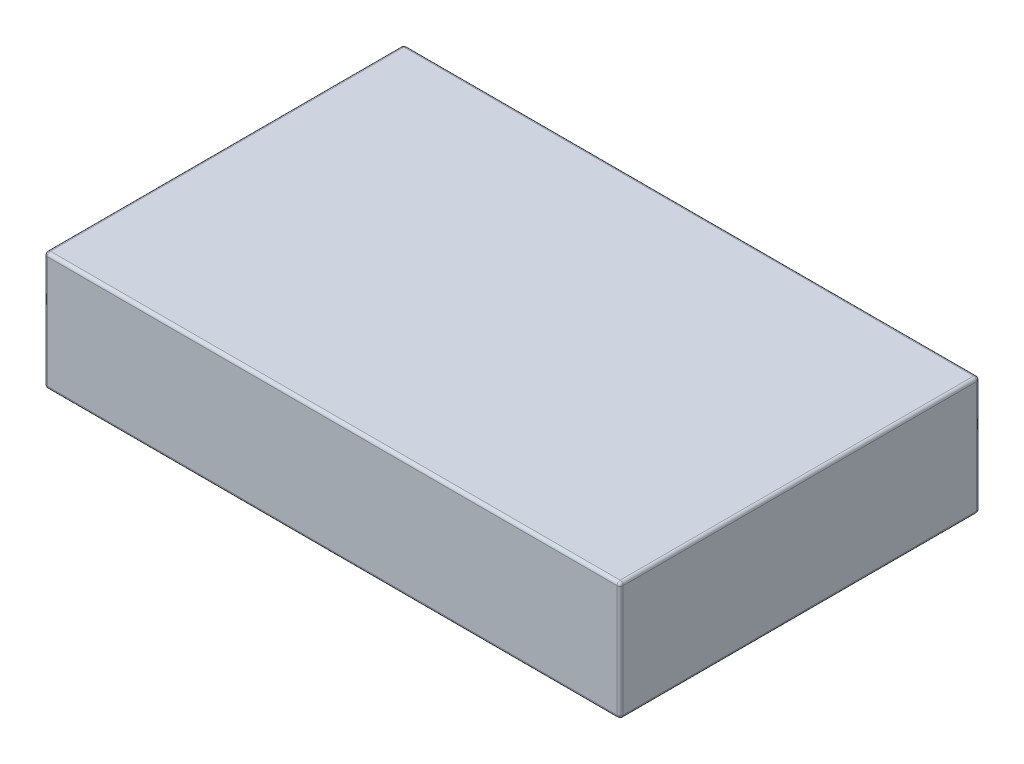
ISO-10303-21;
HEADER;
FILE_DESCRIPTION(('STEP AP214'),'2;1');
FILE_NAME('part.step','',(''),(''),'','','');
FILE_SCHEMA(('AUTOMOTIVE_DESIGN { 1 0 10303 214 1 1 1 1 }'));
ENDSEC;
DATA;
#1=APPLICATION_CONTEXT('core data for automotive mechanical design processes');
#2=APPLICATION_PROTOCOL_DEFINITION('international standard','automotive_design',2000,#1);
#3=PRODUCT_CONTEXT('',#1,'mechanical');
#4=PRODUCT('Part','Part','',(#3));
#5=PRODUCT_RELATED_PRODUCT_CATEGORY('part','',(#4));
#6=PRODUCT_DEFINITION_FORMATION('','',#4);
#7=PRODUCT_DEFINITION_CONTEXT('part definition',#1,'design');
#8=PRODUCT_DEFINITION('design','',#6,#7);
#9=PRODUCT_DEFINITION_SHAPE('','',#8);
#10=(LENGTH_UNIT() NAMED_UNIT(*) SI_UNIT(.MILLI.,.METRE.));
#11=(NAMED_UNIT(*) PLANE_ANGLE_UNIT() SI_UNIT($,.RADIAN.));
#12=(NAMED_UNIT(*) SI_UNIT($,.STERADIAN.) SOLID_ANGLE_UNIT());
#13=UNCERTAINTY_MEASURE_WITH_UNIT(LENGTH_MEASURE(1.E-05),#10,'distance_accuracy_value','');
#14=(GEOMETRIC_REPRESENTATION_CONTEXT(3) GLOBAL_UNCERTAINTY_ASSIGNED_CONTEXT((#13)) GLOBAL_UNIT_ASSIGNED_CONTEXT((#10,
#11,#12)) REPRESENTATION_CONTEXT('',''));
#15=CARTESIAN_POINT('',(0.,0.,0.));
#16=DIRECTION('',(0.,0.,1.));
#17=DIRECTION('',(1.,0.,0.));
#18=AXIS2_PLACEMENT_3D('',#15,#16,#17);
#19=CARTESIAN_POINT('',(-182.5,75.,-114.));
#20=DIRECTION('',(1.,0.,0.));
#21=DIRECTION('',(0.,0.,-1.));
#22=AXIS2_PLACEMENT_3D('',#19,#20,#21);
#23=PLANE('',#22);
#24=DIRECTION('',(0.,-1.,0.));
#25=VECTOR('',#24,1.);
#26=CARTESIAN_POINT('',(-182.5,75.,-112.));
#27=LINE('',#26,#25);
#28=CARTESIAN_POINT('',(-182.5,73.,-112.));
#29=VERTEX_POINT('',#28);
#30=CARTESIAN_POINT('',(-182.5,2.,-112.));
#31=VERTEX_POINT('',#30);
#32=EDGE_CURVE('E48',#29,#31,#27,.T.);
#33=ORIENTED_EDGE('',*,*,#32,.T.);
#34=DIRECTION('',(0.,0.,1.));
#35=VECTOR('',#34,1.);
#36=CARTESIAN_POINT('',(-182.5,2.,-114.));
#37=LINE('',#36,#35);
#38=CARTESIAN_POINT('',(-182.5,2.,112.));
#39=VERTEX_POINT('',#38);
#40=EDGE_CURVE('E11',#31,#39,#37,.T.);
#41=ORIENTED_EDGE('',*,*,#40,.T.);
#42=DIRECTION('',(0.,-1.,0.));
#43=VECTOR('',#42,1.);
#44=CARTESIAN_POINT('',(-182.5,75.,112.));
#45=LINE('',#44,#43);
#46=CARTESIAN_POINT('',(-182.5,73.,112.));
#47=VERTEX_POINT('',#46);
#48=EDGE_CURVE('E304',#39,#47,#45,.F.);
#49=ORIENTED_EDGE('',*,*,#48,.T.);
#50=DIRECTION('',(0.,0.,1.));
#51=VECTOR('',#50,1.);
#52=CARTESIAN_POINT('',(-182.5,73.,-114.));
#53=LINE('',#52,#51);
#54=EDGE_CURVE('E301',#47,#29,#53,.F.);
#55=ORIENTED_EDGE('',*,*,#54,.T.);
#56=EDGE_LOOP('',(#33,#41,#49,#55));
#57=FACE_BOUND('',#56,.T.);
#58=CARTESIAN_POINT('',(-182.5,37.5000000000001,86.));
#59=DIRECTION('',(1.,0.,0.));
#60=DIRECTION('',(0.,0.,-1.));
#61=AXIS2_PLACEMENT_3D('',#58,#59,#60);
#62=CIRCLE('',#61,7.50000000000001);
#63=CARTESIAN_POINT('',(-182.5,37.5000000000001,78.5));
#64=VERTEX_POINT('',#63);
#65=EDGE_CURVE('E152',#64,#64,#62,.F.);
#66=ORIENTED_EDGE('',*,*,#65,.F.);
#67=EDGE_LOOP('',(#66));
#68=FACE_BOUND('',#67,.T.);
#69=CARTESIAN_POINT('',(-182.5,37.5,-86.));
#70=DIRECTION('',(1.,0.,0.));
#71=DIRECTION('',(0.,0.,-1.));
#72=AXIS2_PLACEMENT_3D('',#69,#70,#71);
#73=CIRCLE('',#72,7.50000000000001);
#74=CARTESIAN_POINT('',(-182.5,37.5,-93.5));
#75=VERTEX_POINT('',#74);
#76=EDGE_CURVE('E237',#75,#75,#73,.F.);
#77=ORIENTED_EDGE('',*,*,#76,.F.);
#78=EDGE_LOOP('',(#77));
#79=FACE_BOUND('',#78,.T.);
#80=ADVANCED_FACE('F38',(#57,#68,#79),#23,.F.);
#81=CARTESIAN_POINT('',(-182.5,75.,114.));
#82=DIRECTION('',(0.,0.,-1.));
#83=DIRECTION('',(-1.,0.,0.));
#84=AXIS2_PLACEMENT_3D('',#81,#82,#83);
#85=PLANE('',#84);
#86=DIRECTION('',(1.,0.,0.));
#87=VECTOR('',#86,1.);
#88=CARTESIAN_POINT('',(-182.5,2.,114.));
#89=LINE('',#88,#87);
#90=CARTESIAN_POINT('',(-180.5,2.,114.));
#91=VERTEX_POINT('',#90);
#92=CARTESIAN_POINT('',(180.5,2.,114.));
#93=VERTEX_POINT('',#92);
#94=EDGE_CURVE('E269',#91,#93,#89,.T.);
#95=ORIENTED_EDGE('',*,*,#94,.T.);
#96=DIRECTION('',(0.,-1.,0.));
#97=VECTOR('',#96,1.);
#98=CARTESIAN_POINT('',(180.5,75.,114.));
#99=LINE('',#98,#97);
#100=CARTESIAN_POINT('',(180.5,73.,114.));
#101=VERTEX_POINT('',#100);
#102=EDGE_CURVE('E272',#93,#101,#99,.F.);
#103=ORIENTED_EDGE('',*,*,#102,.T.);
#104=DIRECTION('',(1.,0.,0.));
#105=VECTOR('',#104,1.);
#106=CARTESIAN_POINT('',(-182.5,73.,114.));
#107=LINE('',#106,#105);
#108=CARTESIAN_POINT('',(-180.5,73.,114.));
#109=VERTEX_POINT('',#108);
#110=EDGE_CURVE('E266',#101,#109,#107,.F.);
#111=ORIENTED_EDGE('',*,*,#110,.T.);
#112=DIRECTION('',(0.,-1.,0.));
#113=VECTOR('',#112,1.);
#114=CARTESIAN_POINT('',(-180.5,75.,114.));
#115=LINE('',#114,#113);
#116=EDGE_CURVE('E263',#109,#91,#115,.T.);
#117=ORIENTED_EDGE('',*,*,#116,.T.);
#118=EDGE_LOOP('',(#95,#103,#111,#117));
#119=FACE_BOUND('',#118,.T.);
#120=ADVANCED_FACE('F400',(#119),#85,.F.);
#121=CARTESIAN_POINT('',(182.5,75.,-114.));
#122=DIRECTION('',(-1.,0.,0.));
#123=DIRECTION('',(0.,0.,1.));
#124=AXIS2_PLACEMENT_3D('',#121,#122,#123);
#125=PLANE('',#124);
#126=DIRECTION('',(0.,-1.,0.));
#127=VECTOR('',#126,1.);
#128=CARTESIAN_POINT('',(182.5,75.,112.));
#129=LINE('',#128,#127);
#130=CARTESIAN_POINT('',(182.5,73.,112.));
#131=VERTEX_POINT('',#130);
#132=CARTESIAN_POINT('',(182.5,2.,112.));
#133=VERTEX_POINT('',#132);
#134=EDGE_CURVE('E253',#131,#133,#129,.T.);
#135=ORIENTED_EDGE('',*,*,#134,.T.);
#136=DIRECTION('',(0.,0.,-1.));
#137=VECTOR('',#136,1.);
#138=CARTESIAN_POINT('',(182.5,2.,-114.));
#139=LINE('',#138,#137);
#140=CARTESIAN_POINT('',(182.5,2.,-112.));
#141=VERTEX_POINT('',#140);
#142=EDGE_CURVE('E260',#133,#141,#139,.T.);
#143=ORIENTED_EDGE('',*,*,#142,.T.);
#144=DIRECTION('',(0.,-1.,0.));
#145=VECTOR('',#144,1.);
#146=CARTESIAN_POINT('',(182.5,75.,-112.));
#147=LINE('',#146,#145);
#148=CARTESIAN_POINT('',(182.5,73.,-112.));
#149=VERTEX_POINT('',#148);
#150=EDGE_CURVE('E256',#141,#149,#147,.F.);
#151=ORIENTED_EDGE('',*,*,#150,.T.);
#152=DIRECTION('',(0.,0.,-1.));
#153=VECTOR('',#152,1.);
#154=CARTESIAN_POINT('',(182.5,73.,114.));
#155=LINE('',#154,#153);
#156=EDGE_CURVE('E250',#149,#131,#155,.F.);
#157=ORIENTED_EDGE('',*,*,#156,.T.);
#158=EDGE_LOOP('',(#135,#143,#151,#157));
#159=FACE_BOUND('',#158,.T.);
#160=ADVANCED_FACE('F341',(#159),#125,.F.);
#161=CARTESIAN_POINT('',(-182.5,75.,-114.));
#162=DIRECTION('',(0.,0.,1.));
#163=DIRECTION('',(1.,0.,0.));
#164=AXIS2_PLACEMENT_3D('',#161,#162,#163);
#165=PLANE('',#164);
#166=DIRECTION('',(-1.,0.,0.));
#167=VECTOR('',#166,1.);
#168=CARTESIAN_POINT('',(182.5,73.,-114.));
#169=LINE('',#168,#167);
#170=CARTESIAN_POINT('',(-180.5,73.,-114.));
#171=VERTEX_POINT('',#170);
#172=CARTESIAN_POINT('',(180.5,73.,-114.));
#173=VERTEX_POINT('',#172);
#174=EDGE_CURVE('E142',#171,#173,#169,.F.);
#175=ORIENTED_EDGE('',*,*,#174,.T.);
#176=DIRECTION('',(0.,-1.,0.));
#177=VECTOR('',#176,1.);
#178=CARTESIAN_POINT('',(180.5,75.,-114.));
#179=LINE('',#178,#177);
#180=CARTESIAN_POINT('',(180.5,2.,-114.));
#181=VERTEX_POINT('',#180);
#182=EDGE_CURVE('E137',#173,#181,#179,.T.);
#183=ORIENTED_EDGE('',*,*,#182,.T.);
#184=DIRECTION('',(-1.,0.,0.));
#185=VECTOR('',#184,1.);
#186=CARTESIAN_POINT('',(-182.5,2.,-114.));
#187=LINE('',#186,#185);
#188=CARTESIAN_POINT('',(-180.5,2.,-114.));
#189=VERTEX_POINT('',#188);
#190=EDGE_CURVE('E131',#181,#189,#187,.T.);
#191=ORIENTED_EDGE('',*,*,#190,.T.);
#192=DIRECTION('',(0.,-1.,0.));
#193=VECTOR('',#192,1.);
#194=CARTESIAN_POINT('',(-180.5,75.,-114.));
#195=LINE('',#194,#193);
#196=EDGE_CURVE('E134',#189,#171,#195,.F.);
#197=ORIENTED_EDGE('',*,*,#196,.T.);
#198=EDGE_LOOP('',(#175,#183,#191,#197));
#199=FACE_BOUND('',#198,.T.);
#200=ADVANCED_FACE('F133',(#199),#165,.F.);
#201=CARTESIAN_POINT('',(0.,75.,0.));
#202=DIRECTION('',(0.,1.,0.));
#203=DIRECTION('',(0.,0.,1.));
#204=AXIS2_PLACEMENT_3D('',#201,#202,#203);
#205=PLANE('',#204);
#206=DIRECTION('',(1.,0.,0.));
#207=VECTOR('',#206,1.);
#208=CARTESIAN_POINT('',(182.5,75.,112.));
#209=LINE('',#208,#207);
#210=CARTESIAN_POINT('',(-180.5,75.,112.));
#211=VERTEX_POINT('',#210);
#212=CARTESIAN_POINT('',(180.5,75.,112.));
#213=VERTEX_POINT('',#212);
#214=EDGE_CURVE('E294',#211,#213,#209,.T.);
#215=ORIENTED_EDGE('',*,*,#214,.T.);
#216=DIRECTION('',(0.,0.,-1.));
#217=VECTOR('',#216,1.);
#218=CARTESIAN_POINT('',(180.5,75.,-114.));
#219=LINE('',#218,#217);
#220=CARTESIAN_POINT('',(180.5,75.,-112.));
#221=VERTEX_POINT('',#220);
#222=EDGE_CURVE('E297',#213,#221,#219,.T.);
#223=ORIENTED_EDGE('',*,*,#222,.T.);
#224=DIRECTION('',(-1.,0.,0.));
#225=VECTOR('',#224,1.);
#226=CARTESIAN_POINT('',(-182.5,75.,-112.));
#227=LINE('',#226,#225);
#228=CARTESIAN_POINT('',(-180.5,75.,-112.));
#229=VERTEX_POINT('',#228);
#230=EDGE_CURVE('E291',#221,#229,#227,.T.);
#231=ORIENTED_EDGE('',*,*,#230,.T.);
#232=DIRECTION('',(0.,0.,1.));
#233=VECTOR('',#232,1.);
#234=CARTESIAN_POINT('',(-180.5,75.,114.));
#235=LINE('',#234,#233);
#236=EDGE_CURVE('E288',#229,#211,#235,.T.);
#237=ORIENTED_EDGE('',*,*,#236,.T.);
#238=EDGE_LOOP('',(#215,#223,#231,#237));
#239=FACE_BOUND('',#238,.T.);
#240=ADVANCED_FACE('F371',(#239),#205,.T.);
#241=CARTESIAN_POINT('',(0.,0.,0.));
#242=DIRECTION('',(0.,1.,0.));
#243=DIRECTION('',(0.,0.,1.));
#244=AXIS2_PLACEMENT_3D('',#241,#242,#243);
#245=PLANE('',#244);
#246=DIRECTION('',(-1.,0.,0.));
#247=VECTOR('',#246,1.);
#248=CARTESIAN_POINT('',(0.,0.,-112.));
#249=LINE('',#248,#247);
#250=CARTESIAN_POINT('',(-180.5,0.,-112.));
#251=VERTEX_POINT('',#250);
#252=CARTESIAN_POINT('',(180.5,0.,-112.));
#253=VERTEX_POINT('',#252);
#254=EDGE_CURVE('E160',#251,#253,#249,.F.);
#255=ORIENTED_EDGE('',*,*,#254,.T.);
#256=DIRECTION('',(0.,0.,-1.));
#257=VECTOR('',#256,1.);
#258=CARTESIAN_POINT('',(180.5,0.,0.));
#259=LINE('',#258,#257);
#260=CARTESIAN_POINT('',(180.5,0.,112.));
#261=VERTEX_POINT('',#260);
#262=EDGE_CURVE('E284',#253,#261,#259,.F.);
#263=ORIENTED_EDGE('',*,*,#262,.T.);
#264=DIRECTION('',(1.,0.,0.));
#265=VECTOR('',#264,1.);
#266=CARTESIAN_POINT('',(0.,0.,112.));
#267=LINE('',#266,#265);
#268=CARTESIAN_POINT('',(-180.5,0.,112.));
#269=VERTEX_POINT('',#268);
#270=EDGE_CURVE('E281',#261,#269,#267,.F.);
#271=ORIENTED_EDGE('',*,*,#270,.T.);
#272=DIRECTION('',(0.,0.,1.));
#273=VECTOR('',#272,1.);
#274=CARTESIAN_POINT('',(-180.5,0.,0.));
#275=LINE('',#274,#273);
#276=EDGE_CURVE('E276',#269,#251,#275,.F.);
#277=ORIENTED_EDGE('',*,*,#276,.T.);
#278=EDGE_LOOP('',(#255,#263,#271,#277));
#279=FACE_BOUND('',#278,.T.);
#280=ADVANCED_FACE('F354',(#279),#245,.F.);
#281=CARTESIAN_POINT('',(-197.5,37.5,-86.));
#282=DIRECTION('',(1.,0.,0.));
#283=DIRECTION('',(0.,0.,-1.));
#284=AXIS2_PLACEMENT_3D('',#281,#282,#283);
#285=CYLINDRICAL_SURFACE('',#284,7.50000000000001);
#286=CARTESIAN_POINT('',(-197.5,37.5,-86.));
#287=DIRECTION('',(-1.,0.,0.));
#288=DIRECTION('',(0.,0.,1.));
#289=AXIS2_PLACEMENT_3D('',#286,#287,#288);
#290=CIRCLE('',#289,7.50000000000001);
#291=CARTESIAN_POINT('',(-197.5,37.5,-78.5));
#292=VERTEX_POINT('',#291);
#293=EDGE_CURVE('E231',#292,#292,#290,.T.);
#294=ORIENTED_EDGE('',*,*,#293,.F.);
#295=EDGE_LOOP('',(#294));
#296=FACE_BOUND('',#295,.T.);
#297=ORIENTED_EDGE('',*,*,#76,.T.);
#298=EDGE_LOOP('',(#297));
#299=FACE_BOUND('',#298,.T.);
#300=ADVANCED_FACE('F583',(#296,#299),#285,.T.);
#301=CARTESIAN_POINT('',(-197.5,37.5,-86.));
#302=DIRECTION('',(-1.,0.,0.));
#303=DIRECTION('',(0.,0.,1.));
#304=AXIS2_PLACEMENT_3D('',#301,#302,#303);
#305=PLANE('',#304);
#306=ORIENTED_EDGE('',*,*,#293,.T.);
#307=EDGE_LOOP('',(#306));
#308=FACE_BOUND('',#307,.T.);
#309=ADVANCED_FACE('F574',(#308),#305,.T.);
#310=CARTESIAN_POINT('',(-197.5,37.5000000000001,86.));
#311=DIRECTION('',(1.,0.,0.));
#312=DIRECTION('',(0.,0.,-1.));
#313=AXIS2_PLACEMENT_3D('',#310,#311,#312);
#314=CYLINDRICAL_SURFACE('',#313,7.50000000000001);
#315=CARTESIAN_POINT('',(-197.5,37.5000000000001,86.));
#316=DIRECTION('',(-1.,0.,0.));
#317=DIRECTION('',(0.,0.,-1.));
#318=AXIS2_PLACEMENT_3D('',#315,#316,#317);
#319=CIRCLE('',#318,7.50000000000001);
#320=CARTESIAN_POINT('',(-197.5,37.5000000000001,78.5));
#321=VERTEX_POINT('',#320);
#322=EDGE_CURVE('E224',#321,#321,#319,.T.);
#323=ORIENTED_EDGE('',*,*,#322,.F.);
#324=EDGE_LOOP('',(#323));
#325=FACE_BOUND('',#324,.T.);
#326=ORIENTED_EDGE('',*,*,#65,.T.);
#327=EDGE_LOOP('',(#326));
#328=FACE_BOUND('',#327,.T.);
#329=ADVANCED_FACE('F566',(#325,#328),#314,.T.);
#330=CARTESIAN_POINT('',(-197.5,37.5000000000001,86.));
#331=DIRECTION('',(1.,0.,0.));
#332=DIRECTION('',(0.,0.,-1.));
#333=AXIS2_PLACEMENT_3D('',#330,#331,#332);
#334=PLANE('',#333);
#335=ORIENTED_EDGE('',*,*,#322,.T.);
#336=EDGE_LOOP('',(#335));
#337=FACE_BOUND('',#336,.T.);
#338=ADVANCED_FACE('F558',(#337),#334,.F.);
#339=CARTESIAN_POINT('',(-180.5,75.,112.));
#340=DIRECTION('',(0.,-1.,0.));
#341=DIRECTION('',(0.,0.,-1.));
#342=AXIS2_PLACEMENT_3D('',#339,#340,#341);
#343=CYLINDRICAL_SURFACE('',#342,2.);
#344=CARTESIAN_POINT('',(-180.5,73.,112.));
#345=DIRECTION('',(0.,1.,0.));
#346=DIRECTION('',(0.,0.,1.));
#347=AXIS2_PLACEMENT_3D('',#344,#345,#346);
#348=CIRCLE('',#347,2.);
#349=EDGE_CURVE('E42',#47,#109,#348,.T.);
#350=ORIENTED_EDGE('',*,*,#349,.F.);
#351=ORIENTED_EDGE('',*,*,#48,.F.);
#352=CARTESIAN_POINT('',(-180.5,2.,112.));
#353=DIRECTION('',(0.,-1.,0.));
#354=DIRECTION('',(0.,0.,-1.));
#355=AXIS2_PLACEMENT_3D('',#352,#353,#354);
#356=CIRCLE('',#355,2.);
#357=EDGE_CURVE('E215',#91,#39,#356,.T.);
#358=ORIENTED_EDGE('',*,*,#357,.F.);
#359=ORIENTED_EDGE('',*,*,#116,.F.);
#360=EDGE_LOOP('',(#350,#351,#358,#359));
#361=FACE_BOUND('',#360,.T.);
#362=ADVANCED_FACE('F40',(#361),#343,.T.);
#363=CARTESIAN_POINT('',(-180.5,73.,112.));
#364=DIRECTION('',(0.,0.,1.));
#365=DIRECTION('',(1.,0.,0.));
#366=AXIS2_PLACEMENT_3D('',#363,#364,#365);
#367=SPHERICAL_SURFACE('',#366,2.);
#368=CARTESIAN_POINT('',(-180.5,73.,112.));
#369=DIRECTION('',(0.,0.,1.));
#370=DIRECTION('',(1.,0.,0.));
#371=AXIS2_PLACEMENT_3D('',#368,#369,#370);
#372=CIRCLE('',#371,2.);
#373=EDGE_CURVE('E208',#47,#211,#372,.F.);
#374=ORIENTED_EDGE('',*,*,#373,.F.);
#375=ORIENTED_EDGE('',*,*,#349,.T.);
#376=CARTESIAN_POINT('',(-180.5,73.,112.));
#377=DIRECTION('',(-1.,0.,0.));
#378=DIRECTION('',(0.,0.,1.));
#379=AXIS2_PLACEMENT_3D('',#376,#377,#378);
#380=CIRCLE('',#379,2.);
#381=EDGE_CURVE('E212',#211,#109,#380,.F.);
#382=ORIENTED_EDGE('',*,*,#381,.F.);
#383=EDGE_LOOP('',(#374,#375,#382));
#384=FACE_BOUND('',#383,.T.);
#385=ADVANCED_FACE('F392',(#384),#367,.T.);
#386=CARTESIAN_POINT('',(-180.5,2.,112.));
#387=DIRECTION('',(0.,0.,1.));
#388=DIRECTION('',(1.,0.,0.));
#389=AXIS2_PLACEMENT_3D('',#386,#387,#388);
#390=SPHERICAL_SURFACE('',#389,2.);
#391=CARTESIAN_POINT('',(-180.5,2.,112.));
#392=DIRECTION('',(-1.,0.,0.));
#393=DIRECTION('',(0.,0.,1.));
#394=AXIS2_PLACEMENT_3D('',#391,#392,#393);
#395=CIRCLE('',#394,2.);
#396=EDGE_CURVE('E200',#91,#269,#395,.F.);
#397=ORIENTED_EDGE('',*,*,#396,.F.);
#398=ORIENTED_EDGE('',*,*,#357,.T.);
#399=CARTESIAN_POINT('',(-180.5,2.,112.));
#400=DIRECTION('',(0.,0.,1.));
#401=DIRECTION('',(1.,0.,0.));
#402=AXIS2_PLACEMENT_3D('',#399,#400,#401);
#403=CIRCLE('',#402,2.);
#404=EDGE_CURVE('E204',#269,#39,#403,.F.);
#405=ORIENTED_EDGE('',*,*,#404,.F.);
#406=EDGE_LOOP('',(#397,#398,#405));
#407=FACE_BOUND('',#406,.T.);
#408=ADVANCED_FACE('F390',(#407),#390,.T.);
#409=CARTESIAN_POINT('',(0.,73.,112.));
#410=DIRECTION('',(-1.,0.,0.));
#411=DIRECTION('',(0.,0.,1.));
#412=AXIS2_PLACEMENT_3D('',#409,#410,#411);
#413=CYLINDRICAL_SURFACE('',#412,2.);
#414=ORIENTED_EDGE('',*,*,#381,.T.);
#415=ORIENTED_EDGE('',*,*,#110,.F.);
#416=CARTESIAN_POINT('',(180.5,73.,112.));
#417=DIRECTION('',(1.,0.,0.));
#418=DIRECTION('',(0.,0.,-1.));
#419=AXIS2_PLACEMENT_3D('',#416,#417,#418);
#420=CIRCLE('',#419,2.);
#421=EDGE_CURVE('E193',#213,#101,#420,.T.);
#422=ORIENTED_EDGE('',*,*,#421,.F.);
#423=ORIENTED_EDGE('',*,*,#214,.F.);
#424=EDGE_LOOP('',(#414,#415,#422,#423));
#425=FACE_BOUND('',#424,.T.);
#426=ADVANCED_FACE('F376',(#425),#413,.T.);
#427=CARTESIAN_POINT('',(-180.5,73.,0.));
#428=DIRECTION('',(0.,0.,-1.));
#429=DIRECTION('',(-1.,0.,0.));
#430=AXIS2_PLACEMENT_3D('',#427,#428,#429);
#431=CYLINDRICAL_SURFACE('',#430,2.);
#432=ORIENTED_EDGE('',*,*,#373,.T.);
#433=ORIENTED_EDGE('',*,*,#236,.F.);
#434=CARTESIAN_POINT('',(-180.5,73.,-112.));
#435=DIRECTION('',(0.,0.,-1.));
#436=DIRECTION('',(-1.,0.,0.));
#437=AXIS2_PLACEMENT_3D('',#434,#435,#436);
#438=CIRCLE('',#437,2.);
#439=EDGE_CURVE('E189',#29,#229,#438,.T.);
#440=ORIENTED_EDGE('',*,*,#439,.F.);
#441=ORIENTED_EDGE('',*,*,#54,.F.);
#442=EDGE_LOOP('',(#432,#433,#440,#441));
#443=FACE_BOUND('',#442,.T.);
#444=ADVANCED_FACE('F364',(#443),#431,.T.);
#445=CARTESIAN_POINT('',(-180.5,75.,-112.));
#446=DIRECTION('',(0.,-1.,0.));
#447=DIRECTION('',(0.,0.,-1.));
#448=AXIS2_PLACEMENT_3D('',#445,#446,#447);
#449=CYLINDRICAL_SURFACE('',#448,2.);
#450=CARTESIAN_POINT('',(-180.5,2.,-112.));
#451=DIRECTION('',(0.,-1.,0.));
#452=DIRECTION('',(0.,0.,-1.));
#453=AXIS2_PLACEMENT_3D('',#450,#451,#452);
#454=CIRCLE('',#453,2.);
#455=EDGE_CURVE('E147',#31,#189,#454,.T.);
#456=ORIENTED_EDGE('',*,*,#455,.F.);
#457=ORIENTED_EDGE('',*,*,#32,.F.);
#458=CARTESIAN_POINT('',(-180.5,73.,-112.));
#459=DIRECTION('',(0.,1.,0.));
#460=DIRECTION('',(0.,0.,1.));
#461=AXIS2_PLACEMENT_3D('',#458,#459,#460);
#462=CIRCLE('',#461,2.);
#463=EDGE_CURVE('E149',#171,#29,#462,.T.);
#464=ORIENTED_EDGE('',*,*,#463,.F.);
#465=ORIENTED_EDGE('',*,*,#196,.F.);
#466=EDGE_LOOP('',(#456,#457,#464,#465));
#467=FACE_BOUND('',#466,.T.);
#468=ADVANCED_FACE('F145',(#467),#449,.T.);
#469=CARTESIAN_POINT('',(-180.5,2.,-114.));
#470=DIRECTION('',(0.,0.,1.));
#471=DIRECTION('',(1.,0.,0.));
#472=AXIS2_PLACEMENT_3D('',#469,#470,#471);
#473=CYLINDRICAL_SURFACE('',#472,2.);
#474=ORIENTED_EDGE('',*,*,#404,.T.);
#475=ORIENTED_EDGE('',*,*,#40,.F.);
#476=CARTESIAN_POINT('',(-180.5,2.,-112.));
#477=DIRECTION('',(0.,0.,-1.));
#478=DIRECTION('',(-1.,0.,0.));
#479=AXIS2_PLACEMENT_3D('',#476,#477,#478);
#480=CIRCLE('',#479,2.);
#481=EDGE_CURVE('E56',#251,#31,#480,.T.);
#482=ORIENTED_EDGE('',*,*,#481,.F.);
#483=ORIENTED_EDGE('',*,*,#276,.F.);
#484=EDGE_LOOP('',(#474,#475,#482,#483));
#485=FACE_BOUND('',#484,.T.);
#486=ADVANCED_FACE('F358',(#485),#473,.T.);
#487=CARTESIAN_POINT('',(-182.5,2.,112.));
#488=DIRECTION('',(1.,0.,0.));
#489=DIRECTION('',(0.,0.,-1.));
#490=AXIS2_PLACEMENT_3D('',#487,#488,#489);
#491=CYLINDRICAL_SURFACE('',#490,2.);
#492=ORIENTED_EDGE('',*,*,#396,.T.);
#493=ORIENTED_EDGE('',*,*,#270,.F.);
#494=CARTESIAN_POINT('',(180.5,2.,112.));
#495=DIRECTION('',(1.,0.,0.));
#496=DIRECTION('',(0.,0.,-1.));
#497=AXIS2_PLACEMENT_3D('',#494,#495,#496);
#498=CIRCLE('',#497,2.);
#499=EDGE_CURVE('E181',#93,#261,#498,.T.);
#500=ORIENTED_EDGE('',*,*,#499,.F.);
#501=ORIENTED_EDGE('',*,*,#94,.F.);
#502=EDGE_LOOP('',(#492,#493,#500,#501));
#503=FACE_BOUND('',#502,.T.);
#504=ADVANCED_FACE('F389',(#503),#491,.T.);
#505=CARTESIAN_POINT('',(180.5,75.,112.));
#506=DIRECTION('',(0.,-1.,0.));
#507=DIRECTION('',(0.,0.,-1.));
#508=AXIS2_PLACEMENT_3D('',#505,#506,#507);
#509=CYLINDRICAL_SURFACE('',#508,2.);
#510=CARTESIAN_POINT('',(180.5,73.,112.));
#511=DIRECTION('',(0.,1.,0.));
#512=DIRECTION('',(0.,0.,1.));
#513=AXIS2_PLACEMENT_3D('',#510,#511,#512);
#514=CIRCLE('',#513,2.);
#515=EDGE_CURVE('E196',#101,#131,#514,.T.);
#516=ORIENTED_EDGE('',*,*,#515,.F.);
#517=ORIENTED_EDGE('',*,*,#102,.F.);
#518=CARTESIAN_POINT('',(180.5,2.,112.));
#519=DIRECTION('',(0.,-1.,0.));
#520=DIRECTION('',(0.,0.,-1.));
#521=AXIS2_PLACEMENT_3D('',#518,#519,#520);
#522=CIRCLE('',#521,2.);
#523=EDGE_CURVE('E177',#133,#93,#522,.T.);
#524=ORIENTED_EDGE('',*,*,#523,.F.);
#525=ORIENTED_EDGE('',*,*,#134,.F.);
#526=EDGE_LOOP('',(#516,#517,#524,#525));
#527=FACE_BOUND('',#526,.T.);
#528=ADVANCED_FACE('F382',(#527),#509,.T.);
#529=CARTESIAN_POINT('',(180.5,73.,112.));
#530=DIRECTION('',(0.,0.,1.));
#531=DIRECTION('',(1.,0.,0.));
#532=AXIS2_PLACEMENT_3D('',#529,#530,#531);
#533=SPHERICAL_SURFACE('',#532,2.);
#534=ORIENTED_EDGE('',*,*,#421,.T.);
#535=ORIENTED_EDGE('',*,*,#515,.T.);
#536=CARTESIAN_POINT('',(180.5,73.,112.));
#537=DIRECTION('',(0.,0.,1.));
#538=DIRECTION('',(0.,-1.,0.));
#539=AXIS2_PLACEMENT_3D('',#536,#537,#538);
#540=CIRCLE('',#539,2.);
#541=EDGE_CURVE('E168',#213,#131,#540,.F.);
#542=ORIENTED_EDGE('',*,*,#541,.F.);
#543=EDGE_LOOP('',(#534,#535,#542));
#544=FACE_BOUND('',#543,.T.);
#545=ADVANCED_FACE('F379',(#544),#533,.T.);
#546=CARTESIAN_POINT('',(-180.5,73.,-112.));
#547=DIRECTION('',(0.,0.,1.));
#548=DIRECTION('',(1.,0.,0.));
#549=AXIS2_PLACEMENT_3D('',#546,#547,#548);
#550=SPHERICAL_SURFACE('',#549,2.);
#551=ORIENTED_EDGE('',*,*,#463,.T.);
#552=ORIENTED_EDGE('',*,*,#439,.T.);
#553=CARTESIAN_POINT('',(-180.5,73.,-112.));
#554=DIRECTION('',(-1.,0.,0.));
#555=DIRECTION('',(0.,0.,1.));
#556=AXIS2_PLACEMENT_3D('',#553,#554,#555);
#557=CIRCLE('',#556,2.);
#558=EDGE_CURVE('E162',#171,#229,#557,.F.);
#559=ORIENTED_EDGE('',*,*,#558,.F.);
#560=EDGE_LOOP('',(#551,#552,#559));
#561=FACE_BOUND('',#560,.T.);
#562=ADVANCED_FACE('F366',(#561),#550,.T.);
#563=CARTESIAN_POINT('',(-180.5,2.,-112.));
#564=DIRECTION('',(0.,0.,1.));
#565=DIRECTION('',(1.,0.,0.));
#566=AXIS2_PLACEMENT_3D('',#563,#564,#565);
#567=SPHERICAL_SURFACE('',#566,2.);
#568=ORIENTED_EDGE('',*,*,#481,.T.);
#569=ORIENTED_EDGE('',*,*,#455,.T.);
#570=CARTESIAN_POINT('',(-180.5,2.,-112.));
#571=DIRECTION('',(-1.,0.,0.));
#572=DIRECTION('',(0.,0.,1.));
#573=AXIS2_PLACEMENT_3D('',#570,#571,#572);
#574=CIRCLE('',#573,2.);
#575=EDGE_CURVE('E155',#251,#189,#574,.F.);
#576=ORIENTED_EDGE('',*,*,#575,.F.);
#577=EDGE_LOOP('',(#568,#569,#576));
#578=FACE_BOUND('',#577,.T.);
#579=ADVANCED_FACE('F154',(#578),#567,.T.);
#580=CARTESIAN_POINT('',(180.5,2.,112.));
#581=DIRECTION('',(0.,0.,1.));
#582=DIRECTION('',(1.,0.,0.));
#583=AXIS2_PLACEMENT_3D('',#580,#581,#582);
#584=SPHERICAL_SURFACE('',#583,2.);
#585=ORIENTED_EDGE('',*,*,#523,.T.);
#586=ORIENTED_EDGE('',*,*,#499,.T.);
#587=CARTESIAN_POINT('',(180.5,2.,112.));
#588=DIRECTION('',(0.,0.,1.));
#589=DIRECTION('',(1.,0.,0.));
#590=AXIS2_PLACEMENT_3D('',#587,#588,#589);
#591=CIRCLE('',#590,2.);
#592=EDGE_CURVE('E163',#133,#261,#591,.F.);
#593=ORIENTED_EDGE('',*,*,#592,.F.);
#594=EDGE_LOOP('',(#585,#586,#593));
#595=FACE_BOUND('',#594,.T.);
#596=ADVANCED_FACE('F386',(#595),#584,.T.);
#597=CARTESIAN_POINT('',(180.5,73.,0.));
#598=DIRECTION('',(0.,0.,1.));
#599=DIRECTION('',(1.,0.,0.));
#600=AXIS2_PLACEMENT_3D('',#597,#598,#599);
#601=CYLINDRICAL_SURFACE('',#600,2.);
#602=ORIENTED_EDGE('',*,*,#541,.T.);
#603=ORIENTED_EDGE('',*,*,#156,.F.);
#604=CARTESIAN_POINT('',(180.5,73.,-112.));
#605=DIRECTION('',(0.,0.,-1.));
#606=DIRECTION('',(-1.,0.,0.));
#607=AXIS2_PLACEMENT_3D('',#604,#605,#606);
#608=CIRCLE('',#607,2.);
#609=EDGE_CURVE('E170',#221,#149,#608,.T.);
#610=ORIENTED_EDGE('',*,*,#609,.F.);
#611=ORIENTED_EDGE('',*,*,#222,.F.);
#612=EDGE_LOOP('',(#602,#603,#610,#611));
#613=FACE_BOUND('',#612,.T.);
#614=ADVANCED_FACE('F336',(#613),#601,.T.);
#615=CARTESIAN_POINT('',(0.,73.,-112.));
#616=DIRECTION('',(1.,0.,0.));
#617=DIRECTION('',(0.,0.,-1.));
#618=AXIS2_PLACEMENT_3D('',#615,#616,#617);
#619=CYLINDRICAL_SURFACE('',#618,2.);
#620=ORIENTED_EDGE('',*,*,#558,.T.);
#621=ORIENTED_EDGE('',*,*,#230,.F.);
#622=CARTESIAN_POINT('',(180.5,73.,-112.));
#623=DIRECTION('',(1.,0.,0.));
#624=DIRECTION('',(0.,1.,0.));
#625=AXIS2_PLACEMENT_3D('',#622,#623,#624);
#626=CIRCLE('',#625,2.);
#627=EDGE_CURVE('E323',#173,#221,#626,.T.);
#628=ORIENTED_EDGE('',*,*,#627,.F.);
#629=ORIENTED_EDGE('',*,*,#174,.F.);
#630=EDGE_LOOP('',(#620,#621,#628,#629));
#631=FACE_BOUND('',#630,.T.);
#632=ADVANCED_FACE('F369',(#631),#619,.T.);
#633=CARTESIAN_POINT('',(-182.5,2.,-112.));
#634=DIRECTION('',(-1.,0.,0.));
#635=DIRECTION('',(0.,0.,1.));
#636=AXIS2_PLACEMENT_3D('',#633,#634,#635);
#637=CYLINDRICAL_SURFACE('',#636,2.);
#638=ORIENTED_EDGE('',*,*,#575,.T.);
#639=ORIENTED_EDGE('',*,*,#190,.F.);
#640=CARTESIAN_POINT('',(180.5,2.,-112.));
#641=DIRECTION('',(1.,0.,0.));
#642=DIRECTION('',(0.,0.,-1.));
#643=AXIS2_PLACEMENT_3D('',#640,#641,#642);
#644=CIRCLE('',#643,2.);
#645=EDGE_CURVE('E319',#253,#181,#644,.T.);
#646=ORIENTED_EDGE('',*,*,#645,.F.);
#647=ORIENTED_EDGE('',*,*,#254,.F.);
#648=EDGE_LOOP('',(#638,#639,#646,#647));
#649=FACE_BOUND('',#648,.T.);
#650=ADVANCED_FACE('F159',(#649),#637,.T.);
#651=CARTESIAN_POINT('',(180.5,2.,-114.));
#652=DIRECTION('',(0.,0.,-1.));
#653=DIRECTION('',(-1.,0.,0.));
#654=AXIS2_PLACEMENT_3D('',#651,#652,#653);
#655=CYLINDRICAL_SURFACE('',#654,2.);
#656=ORIENTED_EDGE('',*,*,#592,.T.);
#657=ORIENTED_EDGE('',*,*,#262,.F.);
#658=CARTESIAN_POINT('',(180.5,2.,-112.));
#659=DIRECTION('',(0.,0.,-1.));
#660=DIRECTION('',(-1.,0.,0.));
#661=AXIS2_PLACEMENT_3D('',#658,#659,#660);
#662=CIRCLE('',#661,2.);
#663=EDGE_CURVE('E315',#141,#253,#662,.T.);
#664=ORIENTED_EDGE('',*,*,#663,.F.);
#665=ORIENTED_EDGE('',*,*,#142,.F.);
#666=EDGE_LOOP('',(#656,#657,#664,#665));
#667=FACE_BOUND('',#666,.T.);
#668=ADVANCED_FACE('F351',(#667),#655,.T.);
#669=CARTESIAN_POINT('',(180.5,73.,-112.));
#670=DIRECTION('',(0.,0.,1.));
#671=DIRECTION('',(1.,0.,0.));
#672=AXIS2_PLACEMENT_3D('',#669,#670,#671);
#673=SPHERICAL_SURFACE('',#672,2.);
#674=ORIENTED_EDGE('',*,*,#627,.T.);
#675=ORIENTED_EDGE('',*,*,#609,.T.);
#676=CARTESIAN_POINT('',(180.5,73.,-112.));
#677=DIRECTION('',(0.,1.,0.));
#678=DIRECTION('',(0.,0.,1.));
#679=AXIS2_PLACEMENT_3D('',#676,#677,#678);
#680=CIRCLE('',#679,2.);
#681=EDGE_CURVE('E312',#173,#149,#680,.F.);
#682=ORIENTED_EDGE('',*,*,#681,.F.);
#683=EDGE_LOOP('',(#674,#675,#682));
#684=FACE_BOUND('',#683,.T.);
#685=ADVANCED_FACE('F331',(#684),#673,.T.);
#686=CARTESIAN_POINT('',(180.5,2.,-112.));
#687=DIRECTION('',(0.,0.,1.));
#688=DIRECTION('',(1.,0.,0.));
#689=AXIS2_PLACEMENT_3D('',#686,#687,#688);
#690=SPHERICAL_SURFACE('',#689,2.);
#691=ORIENTED_EDGE('',*,*,#663,.T.);
#692=ORIENTED_EDGE('',*,*,#645,.T.);
#693=CARTESIAN_POINT('',(180.5,2.,-112.));
#694=DIRECTION('',(0.,-1.,0.));
#695=DIRECTION('',(0.,0.,-1.));
#696=AXIS2_PLACEMENT_3D('',#693,#694,#695);
#697=CIRCLE('',#696,2.);
#698=EDGE_CURVE('E309',#141,#181,#697,.F.);
#699=ORIENTED_EDGE('',*,*,#698,.F.);
#700=EDGE_LOOP('',(#691,#692,#699));
#701=FACE_BOUND('',#700,.T.);
#702=ADVANCED_FACE('F348',(#701),#690,.T.);
#703=CARTESIAN_POINT('',(180.5,75.,-112.));
#704=DIRECTION('',(0.,-1.,0.));
#705=DIRECTION('',(0.,0.,-1.));
#706=AXIS2_PLACEMENT_3D('',#703,#704,#705);
#707=CYLINDRICAL_SURFACE('',#706,2.);
#708=ORIENTED_EDGE('',*,*,#681,.T.);
#709=ORIENTED_EDGE('',*,*,#150,.F.);
#710=ORIENTED_EDGE('',*,*,#698,.T.);
#711=ORIENTED_EDGE('',*,*,#182,.F.);
#712=EDGE_LOOP('',(#708,#709,#710,#711));
#713=FACE_BOUND('',#712,.T.);
#714=ADVANCED_FACE('F346',(#713),#707,.T.);
#715=CLOSED_SHELL('',(#80,#120,#160,#200,#240,#280,#300,#309,#329,#338,#362,#385,#408,#426,#444,
#468,#486,#504,#528,#545,#562,#579,#596,#614,#632,#650,#668,#685,#702,#714));
#716=MANIFOLD_SOLID_BREP('B2',#715);
#717=ADVANCED_BREP_SHAPE_REPRESENTATION('',(#18,#716),#14);
#718=SHAPE_DEFINITION_REPRESENTATION(#9,#717);
ENDSEC;
END-ISO-10303-21;
